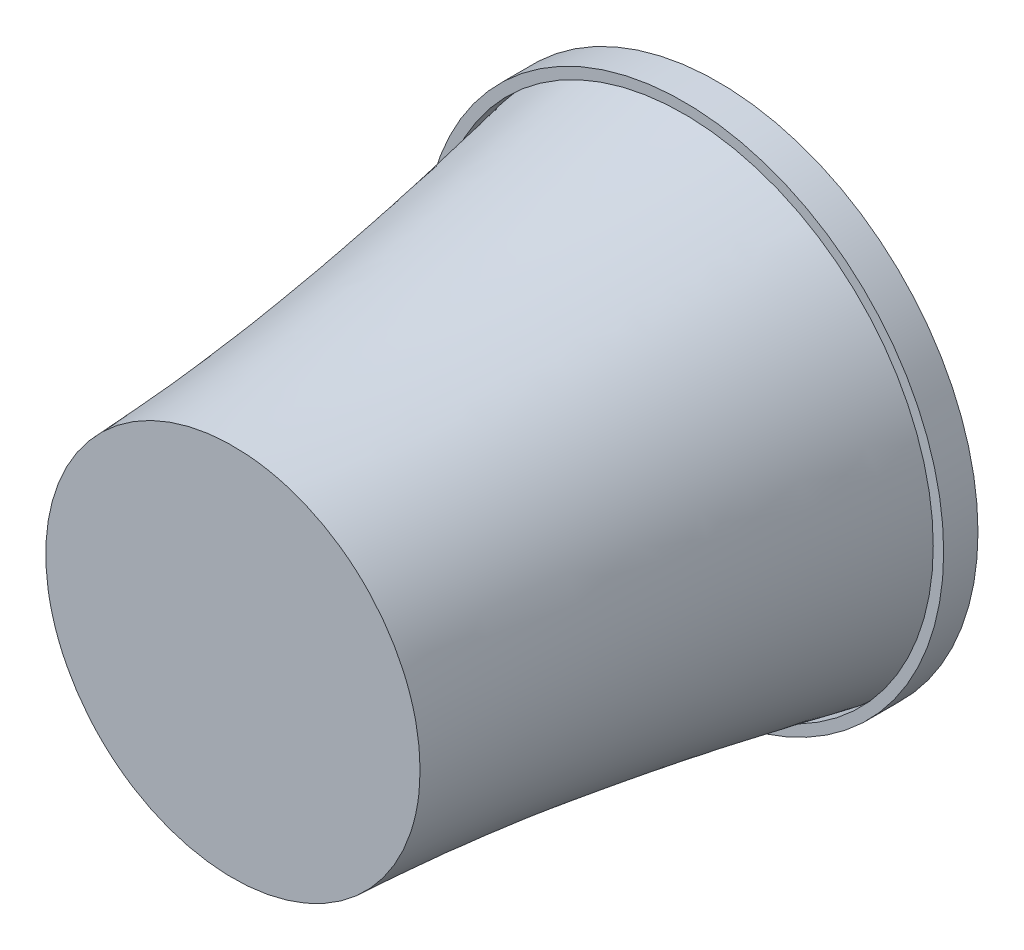
ISO-10303-21;
HEADER;
FILE_DESCRIPTION(('STEP AP214'),'2;1');
FILE_NAME('part.step','',(''),(''),'','','');
FILE_SCHEMA(('AUTOMOTIVE_DESIGN { 1 0 10303 214 1 1 1 1 }'));
ENDSEC;
DATA;
#1=APPLICATION_CONTEXT('core data for automotive mechanical design processes');
#2=APPLICATION_PROTOCOL_DEFINITION('international standard','automotive_design',2000,#1);
#3=PRODUCT_CONTEXT('',#1,'mechanical');
#4=PRODUCT('Part','Part','',(#3));
#5=PRODUCT_RELATED_PRODUCT_CATEGORY('part','',(#4));
#6=PRODUCT_DEFINITION_FORMATION('','',#4);
#7=PRODUCT_DEFINITION_CONTEXT('part definition',#1,'design');
#8=PRODUCT_DEFINITION('design','',#6,#7);
#9=PRODUCT_DEFINITION_SHAPE('','',#8);
#10=(LENGTH_UNIT() NAMED_UNIT(*) SI_UNIT(.MILLI.,.METRE.));
#11=(NAMED_UNIT(*) PLANE_ANGLE_UNIT() SI_UNIT($,.RADIAN.));
#12=(NAMED_UNIT(*) SI_UNIT($,.STERADIAN.) SOLID_ANGLE_UNIT());
#13=UNCERTAINTY_MEASURE_WITH_UNIT(LENGTH_MEASURE(1.E-05),#10,'distance_accuracy_value','');
#14=(GEOMETRIC_REPRESENTATION_CONTEXT(3) GLOBAL_UNCERTAINTY_ASSIGNED_CONTEXT((#13)) GLOBAL_UNIT_ASSIGNED_CONTEXT((#10,
#11,#12)) REPRESENTATION_CONTEXT('',''));
#15=CARTESIAN_POINT('',(0.,0.,0.));
#16=DIRECTION('',(0.,0.,1.));
#17=DIRECTION('',(1.,0.,0.));
#18=AXIS2_PLACEMENT_3D('',#15,#16,#17);
#19=CARTESIAN_POINT('',(0.,0.,5.5));
#20=DIRECTION('',(0.,0.,1.));
#21=DIRECTION('',(1.,0.,0.));
#22=AXIS2_PLACEMENT_3D('',#19,#20,#21);
#23=PLANE('',#22);
#24=CARTESIAN_POINT('',(0.,0.,5.5));
#25=DIRECTION('',(0.,0.,1.));
#26=DIRECTION('',(1.,0.,0.));
#27=AXIS2_PLACEMENT_3D('',#24,#25,#26);
#28=CIRCLE('',#27,83.3368335211512);
#29=CARTESIAN_POINT('',(83.3368335211512,0.,5.5));
#30=VERTEX_POINT('',#29);
#31=EDGE_CURVE('E12',#30,#30,#28,.T.);
#32=ORIENTED_EDGE('',*,*,#31,.T.);
#33=EDGE_LOOP('',(#32));
#34=FACE_BOUND('',#33,.T.);
#35=CARTESIAN_POINT('',(0.,0.,5.5));
#36=DIRECTION('',(0.,0.,1.));
#37=DIRECTION('',(1.,0.,0.));
#38=AXIS2_PLACEMENT_3D('',#35,#36,#37);
#39=CIRCLE('',#38,80.);
#40=CARTESIAN_POINT('',(80.,0.,5.5));
#41=VERTEX_POINT('',#40);
#42=EDGE_CURVE('E66',#41,#41,#39,.T.);
#43=ORIENTED_EDGE('',*,*,#42,.F.);
#44=EDGE_LOOP('',(#43));
#45=FACE_BOUND('',#44,.T.);
#46=ADVANCED_FACE('F55',(#34,#45),#23,.T.);
#47=CARTESIAN_POINT('',(0.,0.,-5.5));
#48=DIRECTION('',(0.,0.,1.));
#49=DIRECTION('',(1.,0.,0.));
#50=AXIS2_PLACEMENT_3D('',#47,#48,#49);
#51=PLANE('',#50);
#52=CARTESIAN_POINT('',(0.,0.,-5.5));
#53=DIRECTION('',(0.,0.,1.));
#54=DIRECTION('',(1.,0.,0.));
#55=AXIS2_PLACEMENT_3D('',#52,#53,#54);
#56=CIRCLE('',#55,83.3368335211512);
#57=CARTESIAN_POINT('',(83.3368335211512,0.,-5.5));
#58=VERTEX_POINT('',#57);
#59=EDGE_CURVE('E59',#58,#58,#56,.T.);
#60=ORIENTED_EDGE('',*,*,#59,.F.);
#61=EDGE_LOOP('',(#60));
#62=FACE_BOUND('',#61,.T.);
#63=CARTESIAN_POINT('',(0.,0.,-5.5));
#64=DIRECTION('',(0.,0.,1.));
#65=DIRECTION('',(1.,0.,0.));
#66=AXIS2_PLACEMENT_3D('',#63,#64,#65);
#67=CIRCLE('',#66,80.);
#68=CARTESIAN_POINT('',(80.,0.,-5.5));
#69=VERTEX_POINT('',#68);
#70=EDGE_CURVE('E68',#69,#69,#67,.T.);
#71=ORIENTED_EDGE('',*,*,#70,.T.);
#72=EDGE_LOOP('',(#71));
#73=FACE_BOUND('',#72,.T.);
#74=ADVANCED_FACE('F78',(#62,#73),#51,.F.);
#75=CARTESIAN_POINT('',(0.,0.,5.5));
#76=DIRECTION('',(0.,0.,-1.));
#77=DIRECTION('',(-1.,0.,0.));
#78=AXIS2_PLACEMENT_3D('',#75,#76,#77);
#79=CYLINDRICAL_SURFACE('',#78,83.3368335211512);
#80=ORIENTED_EDGE('',*,*,#31,.F.);
#81=EDGE_LOOP('',(#80));
#82=FACE_BOUND('',#81,.T.);
#83=ORIENTED_EDGE('',*,*,#59,.T.);
#84=EDGE_LOOP('',(#83));
#85=FACE_BOUND('',#84,.T.);
#86=ADVANCED_FACE('F57',(#82,#85),#79,.T.);
#87=CARTESIAN_POINT('',(0.,0.,5.5));
#88=DIRECTION('',(0.,0.,-1.));
#89=DIRECTION('',(-1.,0.,0.));
#90=AXIS2_PLACEMENT_3D('',#87,#88,#89);
#91=CYLINDRICAL_SURFACE('',#90,80.);
#92=ORIENTED_EDGE('',*,*,#42,.T.);
#93=EDGE_LOOP('',(#92));
#94=FACE_BOUND('',#93,.T.);
#95=ORIENTED_EDGE('',*,*,#70,.F.);
#96=EDGE_LOOP('',(#95));
#97=FACE_BOUND('',#96,.T.);
#98=ADVANCED_FACE('F74',(#94,#97),#91,.F.);
#99=CLOSED_SHELL('',(#46,#74,#86,#98));
#100=MANIFOLD_SOLID_BREP('B2_NOT_SHOWN',#99);
#101=CARTESIAN_POINT('',(0.,0.,0.));
#102=DIRECTION('',(0.,0.,1.));
#103=DIRECTION('',(1.,0.,0.));
#104=AXIS2_PLACEMENT_3D('',#101,#102,#103);
#105=PLANE('',#104);
#106=CARTESIAN_POINT('',(0.,0.,0.));
#107=DIRECTION('',(0.,0.,1.));
#108=DIRECTION('',(1.,0.,0.));
#109=AXIS2_PLACEMENT_3D('',#106,#107,#108);
#110=CIRCLE('',#109,80.);
#111=CARTESIAN_POINT('',(-79.9996052161487,0.251326998870359,0.));
#112=VERTEX_POINT('',#111);
#113=EDGE_CURVE('E54',#112,#112,#110,.T.);
#114=ORIENTED_EDGE('',*,*,#113,.F.);
#115=EDGE_LOOP('',(#114));
#116=FACE_BOUND('',#115,.T.);
#117=ADVANCED_FACE('F117',(#116),#105,.F.);
#118=CARTESIAN_POINT('',(0.,0.,150.));
#119=DIRECTION('',(0.,0.,1.));
#120=DIRECTION('',(1.,0.,0.));
#121=AXIS2_PLACEMENT_3D('',#118,#119,#120);
#122=PLANE('',#121);
#123=CARTESIAN_POINT('',(0.,0.,150.));
#124=DIRECTION('',(0.,0.,1.));
#125=DIRECTION('',(1.,0.,0.));
#126=AXIS2_PLACEMENT_3D('',#123,#124,#125);
#127=CIRCLE('',#126,59.9999999999999);
#128=CARTESIAN_POINT('',(-50.003073395277,-33.1616141197399,150.));
#129=VERTEX_POINT('',#128);
#130=EDGE_CURVE('E125',#129,#129,#127,.T.);
#131=ORIENTED_EDGE('',*,*,#130,.T.);
#132=EDGE_LOOP('',(#131));
#133=FACE_BOUND('',#132,.T.);
#134=ADVANCED_FACE('F149',(#133),#122,.T.);
#135=CARTESIAN_POINT('',(-50.003073395277,-33.1616141197399,150.));
#136=CARTESIAN_POINT('',(-79.9996052161487,0.251326998870359,0.));
#137=CARTESIAN_POINT('',(-116.326301634757,66.8445326708141,150.));
#138=CARTESIAN_POINT('',(-79.4969512184079,160.250537431168,0.));
#139=CARTESIAN_POINT('',(-16.3201548442028,133.167760910294,150.));
#140=CARTESIAN_POINT('',(80.5022592138894,159.747883433427,0.));
#141=CARTESIAN_POINT('',(50.003073395277,33.1616141197399,150.));
#142=CARTESIAN_POINT('',(79.9996052161487,-0.251326998870369,0.));
#143=CARTESIAN_POINT('',(116.326301634757,-66.8445326708142,150.));
#144=CARTESIAN_POINT('',(79.4969512184079,-160.250537431168,0.));
#145=CARTESIAN_POINT('',(16.3201548442028,-133.167760910294,150.));
#146=CARTESIAN_POINT('',(-80.5022592138894,-159.747883433427,0.));
#147=CARTESIAN_POINT('',(-50.003073395277,-33.1616141197399,150.));
#148=CARTESIAN_POINT('',(-79.9996052161487,0.251326998870359,0.));
#149=(BOUNDED_SURFACE() B_SPLINE_SURFACE(3,1,((#135,#136),(#137,#138),(#139,#140),(#141,#142),
(#143,#144),(#145,#146),(#147,#148)),.UNSPECIFIED.,.T.,.F.,.F.) B_SPLINE_SURFACE_WITH_KNOTS((4,
3,4),(2,2),(0.,0.5,1.),(0.,1.),
.UNSPECIFIED.) GEOMETRIC_REPRESENTATION_ITEM() RATIONAL_B_SPLINE_SURFACE(((1.,1.),
(0.333333333333333,0.333333333333333),(0.333333333333333,0.333333333333333),(1.,1.),
(0.333333333333333,0.333333333333333),(0.333333333333333,0.333333333333333),(1.,1.))) REPRESENTATION_ITEM('') SURFACE());
#150=CARTESIAN_POINT('',(-50.003073395277,-33.1616141197399,150.));
#151=CARTESIAN_POINT('',(-50.3155372684111,-32.8135626497544,148.4375));
#152=CARTESIAN_POINT('',(-50.6280011415452,-32.4655111797689,146.875));
#153=CARTESIAN_POINT('',(-51.2529288878133,-31.7694082397978,143.75));
#154=CARTESIAN_POINT('',(-51.5653927609474,-31.4213567698123,142.1875));
#155=CARTESIAN_POINT('',(-52.1903205072156,-30.7252538298412,139.0625));
#156=CARTESIAN_POINT('',(-52.5027843803497,-30.3772023598557,137.5));
#157=CARTESIAN_POINT('',(-53.1277121266178,-29.6810994198847,134.375));
#158=CARTESIAN_POINT('',(-53.4401759997519,-29.3330479498991,132.8125));
#159=CARTESIAN_POINT('',(-54.06510374602,-28.6369450099281,129.6875));
#160=CARTESIAN_POINT('',(-54.3775676191541,-28.2888935399426,128.125));
#161=CARTESIAN_POINT('',(-55.0024953654223,-27.5927905999715,125.));
#162=CARTESIAN_POINT('',(-55.3149592385564,-27.244739129986,123.4375));
#163=CARTESIAN_POINT('',(-55.9398869848245,-26.548636190015,120.3125));
#164=CARTESIAN_POINT('',(-56.2523508579586,-26.2005847200294,118.75));
#165=CARTESIAN_POINT('',(-56.8772786042268,-25.5044817800584,115.625));
#166=CARTESIAN_POINT('',(-57.1897424773608,-25.1564303100729,114.0625));
#167=CARTESIAN_POINT('',(-57.814670223629,-24.4603273701018,110.9375));
#168=CARTESIAN_POINT('',(-58.1271340967631,-24.1122759001163,109.375));
#169=CARTESIAN_POINT('',(-58.7520618430312,-23.4161729601452,106.25));
#170=CARTESIAN_POINT('',(-59.0645257161653,-23.0681214901597,104.6875));
#171=CARTESIAN_POINT('',(-59.6894534624335,-22.3720185501887,101.5625));
#172=CARTESIAN_POINT('',(-60.0019173355676,-22.0239670802032,100.));
#173=CARTESIAN_POINT('',(-60.6268450818357,-21.3278641402321,96.875));
#174=CARTESIAN_POINT('',(-60.9393089549698,-20.9798126702466,95.3125));
#175=CARTESIAN_POINT('',(-61.564236701238,-20.2837097302755,92.1875));
#176=CARTESIAN_POINT('',(-61.876700574372,-19.93565826029,90.625));
#177=CARTESIAN_POINT('',(-62.5016283206402,-19.239555320319,87.5));
#178=CARTESIAN_POINT('',(-62.8140921937743,-18.8915038503334,85.9375));
#179=CARTESIAN_POINT('',(-63.4390199400424,-18.1954009103624,82.8125));
#180=CARTESIAN_POINT('',(-63.7514838131765,-17.8473494403769,81.25));
#181=CARTESIAN_POINT('',(-64.3764115594447,-17.1512465004058,78.125));
#182=CARTESIAN_POINT('',(-64.6888754325788,-16.8031950304203,76.5625));
#183=CARTESIAN_POINT('',(-65.3138031788469,-16.1070920904493,73.4375));
#184=CARTESIAN_POINT('',(-65.626267051981,-15.7590406204637,71.875));
#185=CARTESIAN_POINT('',(-66.2511947982491,-15.0629376804927,68.75));
#186=CARTESIAN_POINT('',(-66.5636586713832,-14.7148862105072,67.1875));
#187=CARTESIAN_POINT('',(-67.1885864176514,-14.0187832705361,64.0625));
#188=CARTESIAN_POINT('',(-67.5010502907855,-13.6707318005506,62.5));
#189=CARTESIAN_POINT('',(-68.1259780370536,-12.9746288605795,59.375));
#190=CARTESIAN_POINT('',(-68.4384419101877,-12.626577390594,57.8125));
#191=CARTESIAN_POINT('',(-69.0633696564559,-11.930474450623,54.6875));
#192=CARTESIAN_POINT('',(-69.37583352959,-11.5824229806374,53.125));
#193=CARTESIAN_POINT('',(-70.0007612758581,-10.8863200406664,50.));
#194=CARTESIAN_POINT('',(-70.3132251489922,-10.5382685706809,48.4375));
#195=CARTESIAN_POINT('',(-70.9381528952603,-9.84216563070983,45.3125));
#196=CARTESIAN_POINT('',(-71.2506167683944,-9.4941141607243,43.75));
#197=CARTESIAN_POINT('',(-71.8755445146626,-8.79801122075326,40.625));
#198=CARTESIAN_POINT('',(-72.1880083877967,-8.44995975076773,39.0625));
#199=CARTESIAN_POINT('',(-72.8129361340648,-7.75385681079668,35.9375));
#200=CARTESIAN_POINT('',(-73.1254000071989,-7.40580534081116,34.375));
#201=CARTESIAN_POINT('',(-73.7503277534671,-6.70970240084011,31.25));
#202=CARTESIAN_POINT('',(-74.0627916266011,-6.36165093085459,29.6875));
#203=CARTESIAN_POINT('',(-74.6877193728693,-5.66554799088354,26.5625));
#204=CARTESIAN_POINT('',(-75.0001832460034,-5.31749652089802,25.));
#205=CARTESIAN_POINT('',(-75.6251109922715,-4.62139358092697,21.875));
#206=CARTESIAN_POINT('',(-75.9375748654056,-4.27334211094145,20.3125));
#207=CARTESIAN_POINT('',(-76.5625026116738,-3.5772391709704,17.1875));
#208=CARTESIAN_POINT('',(-76.8749664848079,-3.22918770098488,15.625));
#209=CARTESIAN_POINT('',(-77.499894231076,-2.53308476101383,12.5));
#210=CARTESIAN_POINT('',(-77.8123581042101,-2.18503329102831,10.9375));
#211=CARTESIAN_POINT('',(-78.4372858504782,-1.48893035105726,7.8125));
#212=CARTESIAN_POINT('',(-78.7497497236123,-1.14087888107174,6.25));
#213=CARTESIAN_POINT('',(-79.3746774698805,-0.444775941100688,3.125));
#214=CARTESIAN_POINT('',(-79.6871413430146,-0.0967244711151647,1.5625));
#215=CARTESIAN_POINT('',(-79.9996052161487,0.251326998870359,0.));
#216=B_SPLINE_CURVE_WITH_KNOTS('',3,(#150,#151,#152,#153,#154,#155,#156,#157,#158,#159,#160,
#161,#162,#163,#164,#165,#166,#167,#168,#169,#170,#171,#172,#173,#174,#175,#176,#177,#178,#179,
#180,#181,#182,#183,#184,#185,#186,#187,#188,#189,#190,#191,#192,#193,#194,#195,#196,#197,#198,
#199,#200,#201,#202,#203,#204,#205,#206,#207,#208,#209,#210,#211,#212,#213,#214,#215),
.UNSPECIFIED.,.F.,.F.,(4,2,2,2,2,2,2,2,2,2,2,2,2,2,2,2,2,2,2,2,2,2,2,2,2,2,2,2,2,2,2,2,4),(0.,
4.89301724194361,9.78603448388719,14.6790517258308,19.5720689677744,24.465086209718,
29.3581034516616,34.2511206936052,39.1441379355488,44.0371551774924,48.930172419436,
53.8231896613795,58.7162069033231,63.6092241452667,68.5022413872103,73.3952586291539,
78.2882758710975,83.1812931130411,88.0743103549847,92.9673275969283,97.8603448388719,
102.753362080815,107.646379322759,112.539396564703,117.432413806646,122.32543104859,
127.218448290533,132.111465532477,137.004482774421,141.897500016364,146.790517258308,
151.683534500251,156.576551742195),.UNSPECIFIED.);
#217=EDGE_CURVE('BSEAM157',#129,#112,#216,.T.);
#218=ORIENTED_EDGE('',*,*,#130,.F.);
#219=ORIENTED_EDGE('',*,*,#113,.T.);
#220=ORIENTED_EDGE('',*,*,#217,.T.);
#221=ORIENTED_EDGE('',*,*,#217,.F.);
#222=EDGE_LOOP('',(#218,#220,#219,#221));
#223=FACE_BOUND('',#222,.T.);
#224=ADVANCED_FACE('F157',(#223),#149,.T.);
#225=CLOSED_SHELL('',(#117,#134,#224));
#226=MANIFOLD_SOLID_BREP('B7',#225);
#227=ADVANCED_BREP_SHAPE_REPRESENTATION('',(#18,#100,#226),#14);
#228=SHAPE_DEFINITION_REPRESENTATION(#9,#227);
ENDSEC;
END-ISO-10303-21;
